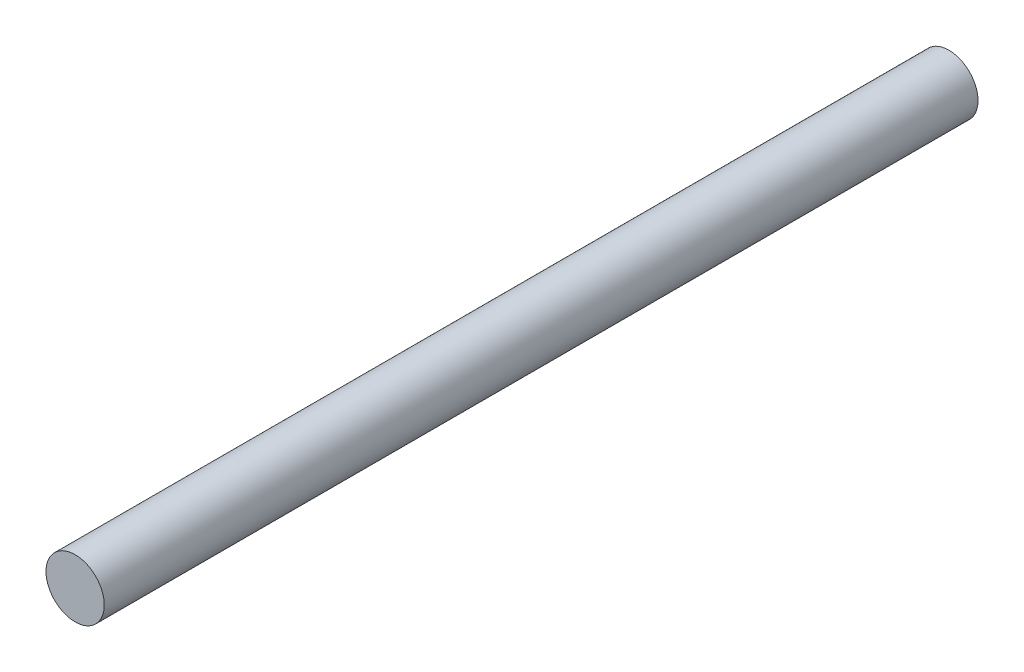
ISO-10303-21;
HEADER;
FILE_DESCRIPTION(('STEP AP214'),'2;1');
FILE_NAME('part.step','',(''),(''),'','','');
FILE_SCHEMA(('AUTOMOTIVE_DESIGN { 1 0 10303 214 1 1 1 1 }'));
ENDSEC;
DATA;
#1=APPLICATION_CONTEXT('core data for automotive mechanical design processes');
#2=APPLICATION_PROTOCOL_DEFINITION('international standard','automotive_design',2000,#1);
#3=PRODUCT_CONTEXT('',#1,'mechanical');
#4=PRODUCT('Part','Part','',(#3));
#5=PRODUCT_RELATED_PRODUCT_CATEGORY('part','',(#4));
#6=PRODUCT_DEFINITION_FORMATION('','',#4);
#7=PRODUCT_DEFINITION_CONTEXT('part definition',#1,'design');
#8=PRODUCT_DEFINITION('design','',#6,#7);
#9=PRODUCT_DEFINITION_SHAPE('','',#8);
#10=(LENGTH_UNIT() NAMED_UNIT(*) SI_UNIT(.MILLI.,.METRE.));
#11=(NAMED_UNIT(*) PLANE_ANGLE_UNIT() SI_UNIT($,.RADIAN.));
#12=(NAMED_UNIT(*) SI_UNIT($,.STERADIAN.) SOLID_ANGLE_UNIT());
#13=UNCERTAINTY_MEASURE_WITH_UNIT(LENGTH_MEASURE(1.E-05),#10,'distance_accuracy_value','');
#14=(GEOMETRIC_REPRESENTATION_CONTEXT(3) GLOBAL_UNCERTAINTY_ASSIGNED_CONTEXT((#13)) GLOBAL_UNIT_ASSIGNED_CONTEXT((#10,
#11,#12)) REPRESENTATION_CONTEXT('',''));
#15=CARTESIAN_POINT('',(0.,0.,0.));
#16=DIRECTION('',(0.,0.,1.));
#17=DIRECTION('',(1.,0.,0.));
#18=AXIS2_PLACEMENT_3D('',#15,#16,#17);
#19=CARTESIAN_POINT('',(0.,0.,45.));
#20=DIRECTION('',(0.,0.,-1.));
#21=DIRECTION('',(-1.,0.,0.));
#22=AXIS2_PLACEMENT_3D('',#19,#20,#21);
#23=CYLINDRICAL_SURFACE('',#22,1.5);
#24=CARTESIAN_POINT('',(0.,0.,45.));
#25=DIRECTION('',(0.,0.,1.));
#26=DIRECTION('',(1.,0.,0.));
#27=AXIS2_PLACEMENT_3D('',#24,#25,#26);
#28=CIRCLE('',#27,1.5);
#29=CARTESIAN_POINT('',(-1.5,0.,45.));
#30=VERTEX_POINT('',#29);
#31=EDGE_CURVE('E10',#30,#30,#28,.T.);
#32=CARTESIAN_POINT('',(0.,0.,0.));
#33=DIRECTION('',(0.,0.,1.));
#34=DIRECTION('',(1.,0.,0.));
#35=AXIS2_PLACEMENT_3D('',#32,#33,#34);
#36=CIRCLE('',#35,1.5);
#37=CARTESIAN_POINT('',(-1.5,0.,0.));
#38=VERTEX_POINT('',#37);
#39=EDGE_CURVE('E38',#38,#38,#36,.T.);
#40=CARTESIAN_POINT('',(-1.5,0.,45.));
#41=CARTESIAN_POINT('',(-1.5,0.,44.53125));
#42=CARTESIAN_POINT('',(-1.5,0.,44.0625));
#43=CARTESIAN_POINT('',(-1.5,0.,43.125));
#44=CARTESIAN_POINT('',(-1.5,0.,42.65625));
#45=CARTESIAN_POINT('',(-1.5,0.,41.71875));
#46=CARTESIAN_POINT('',(-1.5,0.,41.25));
#47=CARTESIAN_POINT('',(-1.5,0.,40.3125));
#48=CARTESIAN_POINT('',(-1.5,0.,39.84375));
#49=CARTESIAN_POINT('',(-1.5,0.,38.90625));
#50=CARTESIAN_POINT('',(-1.5,0.,38.4375));
#51=CARTESIAN_POINT('',(-1.5,0.,37.5));
#52=CARTESIAN_POINT('',(-1.5,0.,37.03125));
#53=CARTESIAN_POINT('',(-1.5,0.,36.09375));
#54=CARTESIAN_POINT('',(-1.5,0.,35.625));
#55=CARTESIAN_POINT('',(-1.5,0.,34.6875));
#56=CARTESIAN_POINT('',(-1.5,0.,34.21875));
#57=CARTESIAN_POINT('',(-1.5,0.,33.28125));
#58=CARTESIAN_POINT('',(-1.5,0.,32.8125));
#59=CARTESIAN_POINT('',(-1.5,0.,31.875));
#60=CARTESIAN_POINT('',(-1.5,0.,31.40625));
#61=CARTESIAN_POINT('',(-1.5,0.,30.46875));
#62=CARTESIAN_POINT('',(-1.5,0.,30.));
#63=CARTESIAN_POINT('',(-1.5,0.,29.0625));
#64=CARTESIAN_POINT('',(-1.5,0.,28.59375));
#65=CARTESIAN_POINT('',(-1.5,0.,27.65625));
#66=CARTESIAN_POINT('',(-1.5,0.,27.1875));
#67=CARTESIAN_POINT('',(-1.5,0.,26.25));
#68=CARTESIAN_POINT('',(-1.5,0.,25.78125));
#69=CARTESIAN_POINT('',(-1.5,0.,24.84375));
#70=CARTESIAN_POINT('',(-1.5,0.,24.375));
#71=CARTESIAN_POINT('',(-1.5,0.,23.4375));
#72=CARTESIAN_POINT('',(-1.5,0.,22.96875));
#73=CARTESIAN_POINT('',(-1.5,0.,22.03125));
#74=CARTESIAN_POINT('',(-1.5,0.,21.5625));
#75=CARTESIAN_POINT('',(-1.5,0.,20.625));
#76=CARTESIAN_POINT('',(-1.5,0.,20.15625));
#77=CARTESIAN_POINT('',(-1.5,0.,19.21875));
#78=CARTESIAN_POINT('',(-1.5,0.,18.75));
#79=CARTESIAN_POINT('',(-1.5,0.,17.8125));
#80=CARTESIAN_POINT('',(-1.5,0.,17.34375));
#81=CARTESIAN_POINT('',(-1.5,0.,16.40625));
#82=CARTESIAN_POINT('',(-1.5,0.,15.9375));
#83=CARTESIAN_POINT('',(-1.5,0.,15.));
#84=CARTESIAN_POINT('',(-1.5,0.,14.53125));
#85=CARTESIAN_POINT('',(-1.5,0.,13.59375));
#86=CARTESIAN_POINT('',(-1.5,0.,13.125));
#87=CARTESIAN_POINT('',(-1.5,0.,12.1875));
#88=CARTESIAN_POINT('',(-1.5,0.,11.71875));
#89=CARTESIAN_POINT('',(-1.5,0.,10.78125));
#90=CARTESIAN_POINT('',(-1.5,0.,10.3125));
#91=CARTESIAN_POINT('',(-1.5,0.,9.37499999999999));
#92=CARTESIAN_POINT('',(-1.5,0.,8.90624999999999));
#93=CARTESIAN_POINT('',(-1.5,0.,7.96874999999999));
#94=CARTESIAN_POINT('',(-1.5,0.,7.5));
#95=CARTESIAN_POINT('',(-1.5,0.,6.56249999999999));
#96=CARTESIAN_POINT('',(-1.5,0.,6.09374999999999));
#97=CARTESIAN_POINT('',(-1.5,0.,5.15624999999999));
#98=CARTESIAN_POINT('',(-1.5,0.,4.68749999999999));
#99=CARTESIAN_POINT('',(-1.5,0.,3.74999999999999));
#100=CARTESIAN_POINT('',(-1.5,0.,3.28124999999999));
#101=CARTESIAN_POINT('',(-1.5,0.,2.34374999999999));
#102=CARTESIAN_POINT('',(-1.5,0.,1.87499999999999));
#103=CARTESIAN_POINT('',(-1.5,0.,0.937499999999992));
#104=CARTESIAN_POINT('',(-1.5,0.,0.468749999999993));
#105=CARTESIAN_POINT('',(-1.5,0.,0.));
#106=B_SPLINE_CURVE_WITH_KNOTS('',3,(#40,#41,#42,#43,#44,#45,#46,#47,#48,#49,#50,#51,#52,#53,
#54,#55,#56,#57,#58,#59,#60,#61,#62,#63,#64,#65,#66,#67,#68,#69,#70,#71,#72,#73,#74,#75,#76,#77,
#78,#79,#80,#81,#82,#83,#84,#85,#86,#87,#88,#89,#90,#91,#92,#93,#94,#95,#96,#97,#98,#99,#100,
#101,#102,#103,#104,#105),.UNSPECIFIED.,.F.,.F.,(4,2,2,2,2,2,2,2,2,2,2,2,2,2,2,2,2,2,2,2,2,2,2,
2,2,2,2,2,2,2,2,2,4),(0.,1.40625,2.8125,4.21874999999999,5.625,7.03125,8.43749999999999,9.84375,
11.25,12.65625,14.0625,15.46875,16.875,18.28125,19.6875,21.09375,22.5,23.90625,25.3125,26.71875,
28.125,29.53125,30.9375,32.34375,33.75,35.15625,36.5625,37.96875,39.375,40.78125,42.1875,
43.59375,45.),.UNSPECIFIED.);
#107=EDGE_CURVE('BSEAM35',#30,#38,#106,.T.);
#108=ORIENTED_EDGE('',*,*,#31,.F.);
#109=ORIENTED_EDGE('',*,*,#39,.T.);
#110=ORIENTED_EDGE('',*,*,#107,.T.);
#111=ORIENTED_EDGE('',*,*,#107,.F.);
#112=EDGE_LOOP('',(#108,#110,#109,#111));
#113=FACE_BOUND('',#112,.T.);
#114=ADVANCED_FACE('F35',(#113),#23,.T.);
#115=CARTESIAN_POINT('',(0.,0.,45.));
#116=DIRECTION('',(0.,0.,1.));
#117=DIRECTION('',(1.,0.,0.));
#118=AXIS2_PLACEMENT_3D('',#115,#116,#117);
#119=PLANE('',#118);
#120=ORIENTED_EDGE('',*,*,#31,.T.);
#121=EDGE_LOOP('',(#120));
#122=FACE_BOUND('',#121,.T.);
#123=ADVANCED_FACE('F50',(#122),#119,.T.);
#124=CARTESIAN_POINT('',(0.,0.,0.));
#125=DIRECTION('',(0.,0.,1.));
#126=DIRECTION('',(1.,0.,0.));
#127=AXIS2_PLACEMENT_3D('',#124,#125,#126);
#128=PLANE('',#127);
#129=ORIENTED_EDGE('',*,*,#39,.F.);
#130=EDGE_LOOP('',(#129));
#131=FACE_BOUND('',#130,.T.);
#132=ADVANCED_FACE('F48',(#131),#128,.F.);
#133=CLOSED_SHELL('',(#114,#123,#132));
#134=MANIFOLD_SOLID_BREP('B2',#133);
#135=ADVANCED_BREP_SHAPE_REPRESENTATION('',(#18,#134),#14);
#136=SHAPE_DEFINITION_REPRESENTATION(#9,#135);
ENDSEC;
END-ISO-10303-21;
